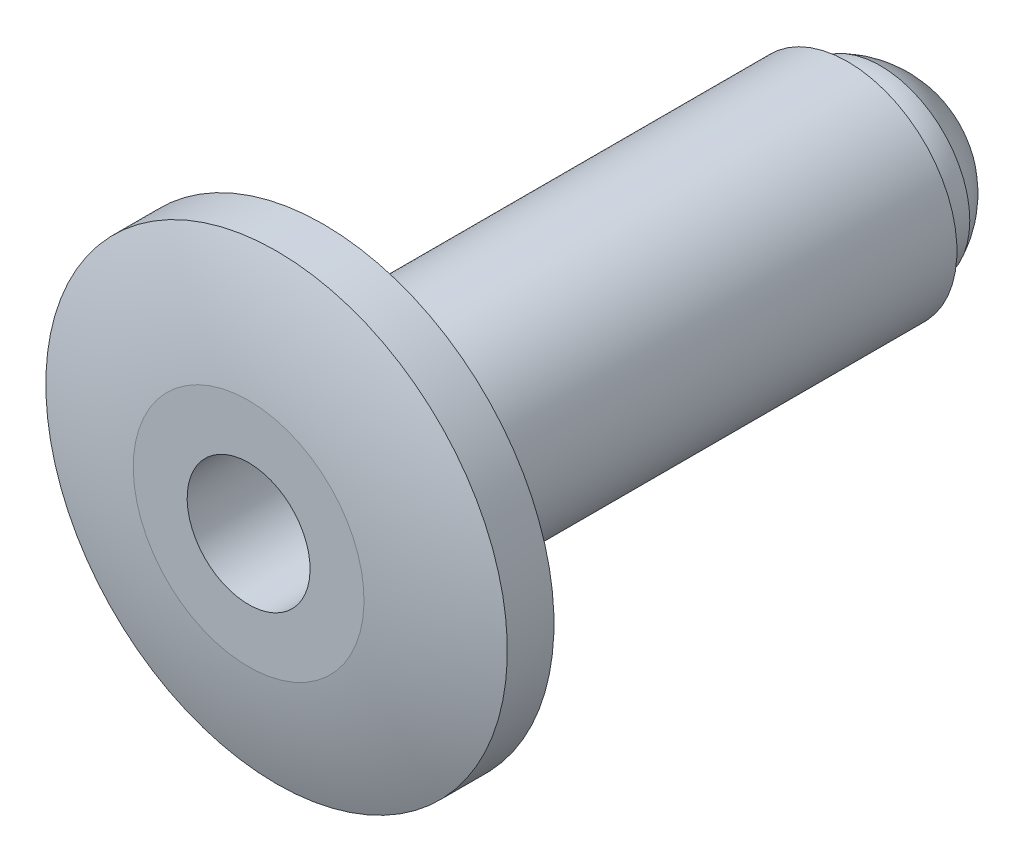
ISO-10303-21;
HEADER;
FILE_DESCRIPTION(('STEP AP214'),'2;1');
FILE_NAME('part.step','',(''),(''),'','','');
FILE_SCHEMA(('AUTOMOTIVE_DESIGN { 1 0 10303 214 1 1 1 1 }'));
ENDSEC;
DATA;
#1=APPLICATION_CONTEXT('core data for automotive mechanical design processes');
#2=APPLICATION_PROTOCOL_DEFINITION('international standard','automotive_design',2000,#1);
#3=PRODUCT_CONTEXT('',#1,'mechanical');
#4=PRODUCT('Part','Part','',(#3));
#5=PRODUCT_RELATED_PRODUCT_CATEGORY('part','',(#4));
#6=PRODUCT_DEFINITION_FORMATION('','',#4);
#7=PRODUCT_DEFINITION_CONTEXT('part definition',#1,'design');
#8=PRODUCT_DEFINITION('design','',#6,#7);
#9=PRODUCT_DEFINITION_SHAPE('','',#8);
#10=(LENGTH_UNIT() NAMED_UNIT(*) SI_UNIT(.MILLI.,.METRE.));
#11=(NAMED_UNIT(*) PLANE_ANGLE_UNIT() SI_UNIT($,.RADIAN.));
#12=(NAMED_UNIT(*) SI_UNIT($,.STERADIAN.) SOLID_ANGLE_UNIT());
#13=UNCERTAINTY_MEASURE_WITH_UNIT(LENGTH_MEASURE(1.E-05),#10,'distance_accuracy_value','');
#14=(GEOMETRIC_REPRESENTATION_CONTEXT(3) GLOBAL_UNCERTAINTY_ASSIGNED_CONTEXT((#13)) GLOBAL_UNIT_ASSIGNED_CONTEXT((#10,
#11,#12)) REPRESENTATION_CONTEXT('',''));
#15=CARTESIAN_POINT('',(0.,0.,0.));
#16=DIRECTION('',(0.,0.,1.));
#17=DIRECTION('',(1.,0.,0.));
#18=AXIS2_PLACEMENT_3D('',#15,#16,#17);
#19=CARTESIAN_POINT('',(0.,0.,-5.61113958093253));
#20=DIRECTION('',(1.,0.,0.));
#21=DIRECTION('',(0.,-1.,0.));
#22=AXIS2_PLACEMENT_3D('',#19,#20,#21);
#23=SPHERICAL_SURFACE('',#22,1.07764284094247);
#24=CARTESIAN_POINT('',(0.,0.,-5.61113958093253));
#25=DIRECTION('',(0.,0.,1.));
#26=DIRECTION('',(1.,0.,0.));
#27=AXIS2_PLACEMENT_3D('',#24,#25,#26);
#28=SPHERICAL_SURFACE('',#27,1.07764284094247);
#29=CARTESIAN_POINT('',(0.,0.,-6.07129453125));
#30=DIRECTION('',(0.,0.,1.));
#31=DIRECTION('',(1.,0.,0.));
#32=AXIS2_PLACEMENT_3D('',#29,#30,#31);
#33=CIRCLE('',#32,0.974459601180514);
#34=CARTESIAN_POINT('',(0.974459601180514,0.,-6.07129453125));
#35=VERTEX_POINT('',#34);
#36=EDGE_CURVE('P0_E26',#35,#35,#33,.T.);
#37=ORIENTED_EDGE('',*,*,#36,.F.);
#38=EDGE_LOOP('',(#37));
#39=FACE_BOUND('',#38,.T.);
#40=ADVANCED_FACE('P0_F17',(#39),#28,.T.);
#41=CARTESIAN_POINT('',(0.,0.9525,-5.715));
#42=DIRECTION('',(0.,0.,-1.));
#43=DIRECTION('',(0.,-1.,0.));
#44=AXIS2_PLACEMENT_3D('',#41,#42,#43);
#45=PLANE('',#44);
#46=CARTESIAN_POINT('',(0.,0.,-5.715));
#47=DIRECTION('',(0.,0.,1.));
#48=DIRECTION('',(1.,0.,0.));
#49=AXIS2_PLACEMENT_3D('',#46,#47,#48);
#50=CIRCLE('',#49,0.9525);
#51=CARTESIAN_POINT('',(0.9525,0.,-5.715));
#52=VERTEX_POINT('',#51);
#53=EDGE_CURVE('P0_E11',#52,#52,#50,.T.);
#54=ORIENTED_EDGE('',*,*,#53,.T.);
#55=EDGE_LOOP('',(#54));
#56=FACE_BOUND('',#55,.T.);
#57=ADVANCED_FACE('P0_F19',(#56),#45,.F.);
#58=CARTESIAN_POINT('',(0.,0.,-5.9525296875));
#59=DIRECTION('',(-1.,0.,0.));
#60=DIRECTION('',(0.,1.,0.));
#61=AXIS2_PLACEMENT_3D('',#58,#59,#60);
#62=SPHERICAL_SURFACE('',#61,0.9816703125);
#63=CARTESIAN_POINT('',(0.,0.,-5.9525296875));
#64=DIRECTION('',(0.,0.,1.));
#65=DIRECTION('',(1.,0.,0.));
#66=AXIS2_PLACEMENT_3D('',#63,#64,#65);
#67=SPHERICAL_SURFACE('',#66,0.9816703125);
#68=ORIENTED_EDGE('',*,*,#53,.F.);
#69=EDGE_LOOP('',(#68));
#70=FACE_BOUND('',#69,.T.);
#71=ORIENTED_EDGE('',*,*,#36,.T.);
#72=EDGE_LOOP('',(#71));
#73=FACE_BOUND('',#72,.T.);
#74=ADVANCED_FACE('P0_F42',(#70,#73),#67,.T.);
#75=CLOSED_SHELL('',(#40,#57,#74));
#76=MANIFOLD_SOLID_BREP('P0_B1',#75);
#77=CARTESIAN_POINT('',(0.,1.190625,0.));
#78=DIRECTION('',(0.,0.,-1.));
#79=DIRECTION('',(-1.,0.,0.));
#80=AXIS2_PLACEMENT_3D('',#77,#78,#79);
#81=PLANE('',#80);
#82=CARTESIAN_POINT('',(0.,0.,0.));
#83=DIRECTION('',(0.,0.,-1.));
#84=DIRECTION('',(0.,1.,0.));
#85=AXIS2_PLACEMENT_3D('',#82,#83,#84);
#86=CIRCLE('',#85,1.190625);
#87=CARTESIAN_POINT('',(0.,1.190625,0.));
#88=VERTEX_POINT('',#87);
#89=EDGE_CURVE('P1_E11',#88,#88,#86,.T.);
#90=ORIENTED_EDGE('',*,*,#89,.F.);
#91=EDGE_LOOP('',(#90));
#92=FACE_BOUND('',#91,.T.);
#93=CARTESIAN_POINT('',(0.,0.,0.));
#94=DIRECTION('',(0.,0.,1.));
#95=DIRECTION('',(0.,1.,0.));
#96=AXIS2_PLACEMENT_3D('',#93,#94,#95);
#97=CIRCLE('',#96,1.35924380805);
#98=CARTESIAN_POINT('',(0.,1.35924380805,0.));
#99=VERTEX_POINT('',#98);
#100=EDGE_CURVE('P1_E224',#99,#99,#97,.T.);
#101=ORIENTED_EDGE('',*,*,#100,.F.);
#102=EDGE_LOOP('',(#101));
#103=FACE_BOUND('',#102,.T.);
#104=ADVANCED_FACE('P1_F17',(#92,#103),#81,.T.);
#105=CARTESIAN_POINT('',(0.,0.,-5.715));
#106=DIRECTION('',(0.,0.,-1.));
#107=DIRECTION('',(0.,1.,0.));
#108=AXIS2_PLACEMENT_3D('',#105,#106,#107);
#109=CYLINDRICAL_SURFACE('',#108,1.190625);
#110=ORIENTED_EDGE('',*,*,#89,.T.);
#111=EDGE_LOOP('',(#110));
#112=FACE_BOUND('',#111,.T.);
#113=CARTESIAN_POINT('',(0.,0.,-5.715));
#114=DIRECTION('',(0.,0.,-1.));
#115=DIRECTION('',(0.,1.,0.));
#116=AXIS2_PLACEMENT_3D('',#113,#114,#115);
#117=CIRCLE('',#116,1.190625);
#118=CARTESIAN_POINT('',(0.,1.190625,-5.715));
#119=VERTEX_POINT('',#118);
#120=EDGE_CURVE('P1_E26',#119,#119,#117,.T.);
#121=ORIENTED_EDGE('',*,*,#120,.F.);
#122=EDGE_LOOP('',(#121));
#123=FACE_BOUND('',#122,.T.);
#124=ADVANCED_FACE('P1_F19',(#112,#123),#109,.T.);
#125=CARTESIAN_POINT('',(0.,1.190625,-5.715));
#126=DIRECTION('',(0.,0.,-1.));
#127=DIRECTION('',(-1.,0.,0.));
#128=AXIS2_PLACEMENT_3D('',#125,#126,#127);
#129=PLANE('',#128);
#130=ORIENTED_EDGE('',*,*,#120,.T.);
#131=EDGE_LOOP('',(#130));
#132=FACE_BOUND('',#131,.T.);
#133=ADVANCED_FACE('P1_F595',(#132),#129,.T.);
#134=CARTESIAN_POINT('',(0.,0.,9.3853));
#135=DIRECTION('',(0.,0.,1.));
#136=DIRECTION('',(1.,0.,0.));
#137=AXIS2_PLACEMENT_3D('',#134,#135,#136);
#138=CYLINDRICAL_SURFACE('',#137,1.35924380805);
#139=ORIENTED_EDGE('',*,*,#100,.T.);
#140=EDGE_LOOP('',(#139));
#141=FACE_BOUND('',#140,.T.);
#142=CARTESIAN_POINT('',(0.,0.,-0.0254000000000018));
#143=DIRECTION('',(0.,0.,1.));
#144=DIRECTION('',(1.,0.,0.));
#145=AXIS2_PLACEMENT_3D('',#142,#143,#144);
#146=CIRCLE('',#145,1.35924380805);
#147=CARTESIAN_POINT('',(1.35924380805,0.,-0.0254000000000018));
#148=VERTEX_POINT('',#147);
#149=EDGE_CURVE('P1_E221',#148,#148,#146,.T.);
#150=ORIENTED_EDGE('',*,*,#149,.F.);
#151=EDGE_LOOP('',(#150));
#152=FACE_BOUND('',#151,.T.);
#153=ADVANCED_FACE('P1_F586',(#141,#152),#138,.F.);
#154=CARTESIAN_POINT('',(1.43418608895,0.,-0.025400000000001));
#155=DIRECTION('',(0.,0.,-1.));
#156=DIRECTION('',(0.,-1.,0.));
#157=AXIS2_PLACEMENT_3D('',#154,#155,#156);
#158=PLANE('',#157);
#159=ORIENTED_EDGE('',*,*,#149,.T.);
#160=EDGE_LOOP('',(#159));
#161=FACE_BOUND('',#160,.T.);
#162=CARTESIAN_POINT('',(0.,0.,-0.0254000000000018));
#163=DIRECTION('',(0.,0.,1.));
#164=DIRECTION('',(1.,0.,0.));
#165=AXIS2_PLACEMENT_3D('',#162,#163,#164);
#166=CIRCLE('',#165,1.43418608895);
#167=CARTESIAN_POINT('',(1.43418608895,0.,-0.0254000000000018));
#168=VERTEX_POINT('',#167);
#169=EDGE_CURVE('P1_E218',#168,#168,#166,.T.);
#170=ORIENTED_EDGE('',*,*,#169,.F.);
#171=EDGE_LOOP('',(#170));
#172=FACE_BOUND('',#171,.T.);
#173=ADVANCED_FACE('P1_F577',(#161,#172),#158,.T.);
#174=CARTESIAN_POINT('',(0.,0.,9.3853));
#175=DIRECTION('',(0.,0.,1.));
#176=DIRECTION('',(1.,0.,0.));
#177=AXIS2_PLACEMENT_3D('',#174,#175,#176);
#178=CYLINDRICAL_SURFACE('',#177,1.43418608895);
#179=ORIENTED_EDGE('',*,*,#169,.T.);
#180=EDGE_LOOP('',(#179));
#181=FACE_BOUND('',#180,.T.);
#182=CARTESIAN_POINT('',(0.,0.,0.));
#183=DIRECTION('',(0.,0.,-1.));
#184=DIRECTION('',(0.,1.,0.));
#185=AXIS2_PLACEMENT_3D('',#182,#183,#184);
#186=CIRCLE('',#185,1.43418608895);
#187=CARTESIAN_POINT('',(0.,1.43418608895,0.));
#188=VERTEX_POINT('',#187);
#189=EDGE_CURVE('P1_E151',#188,#188,#186,.T.);
#190=ORIENTED_EDGE('',*,*,#189,.T.);
#191=EDGE_LOOP('',(#190));
#192=FACE_BOUND('',#191,.T.);
#193=ADVANCED_FACE('P1_F568',(#181,#192),#178,.T.);
#194=CARTESIAN_POINT('',(0.,1.190625,0.));
#195=DIRECTION('',(0.,0.,-1.));
#196=DIRECTION('',(-1.,0.,0.));
#197=AXIS2_PLACEMENT_3D('',#194,#195,#196);
#198=PLANE('',#197);
#199=CARTESIAN_POINT('',(0.,0.,0.));
#200=DIRECTION('',(0.,0.,-1.));
#201=DIRECTION('',(0.,1.,0.));
#202=AXIS2_PLACEMENT_3D('',#199,#200,#201);
#203=CIRCLE('',#202,2.2660426265925);
#204=CARTESIAN_POINT('',(0.,2.2660426265925,0.));
#205=VERTEX_POINT('',#204);
#206=EDGE_CURVE('P1_E166',#205,#205,#203,.T.);
#207=ORIENTED_EDGE('',*,*,#206,.F.);
#208=EDGE_LOOP('',(#207));
#209=FACE_BOUND('',#208,.T.);
#210=CARTESIAN_POINT('',(0.,0.,0.));
#211=DIRECTION('',(0.,0.,-1.));
#212=DIRECTION('',(0.,1.,0.));
#213=AXIS2_PLACEMENT_3D('',#210,#211,#212);
#214=CIRCLE('',#213,2.5146);
#215=CARTESIAN_POINT('',(0.,2.5146,0.));
#216=VERTEX_POINT('',#215);
#217=EDGE_CURVE('P1_E215',#216,#216,#214,.T.);
#218=ORIENTED_EDGE('',*,*,#217,.T.);
#219=EDGE_LOOP('',(#218));
#220=FACE_BOUND('',#219,.T.);
#221=ADVANCED_FACE('P1_F559',(#209,#220),#198,.T.);
#222=CARTESIAN_POINT('',(0.,0.,-5.715));
#223=DIRECTION('',(0.,0.,-1.));
#224=DIRECTION('',(0.,1.,0.));
#225=AXIS2_PLACEMENT_3D('',#222,#223,#224);
#226=CYLINDRICAL_SURFACE('',#225,2.5146);
#227=CARTESIAN_POINT('',(0.,0.,0.508));
#228=DIRECTION('',(0.,0.,-1.));
#229=DIRECTION('',(0.,1.,0.));
#230=AXIS2_PLACEMENT_3D('',#227,#228,#229);
#231=CIRCLE('',#230,2.5146);
#232=CARTESIAN_POINT('',(0.,2.5146,0.508));
#233=VERTEX_POINT('',#232);
#234=EDGE_CURVE('P1_E212',#233,#233,#231,.T.);
#235=ORIENTED_EDGE('',*,*,#234,.T.);
#236=EDGE_LOOP('',(#235));
#237=FACE_BOUND('',#236,.T.);
#238=ORIENTED_EDGE('',*,*,#217,.F.);
#239=EDGE_LOOP('',(#238));
#240=FACE_BOUND('',#239,.T.);
#241=ADVANCED_FACE('P1_F550',(#237,#240),#226,.T.);
#242=CARTESIAN_POINT('',(0.,0.,-4.66347968749999));
#243=DIRECTION('',(0.,0.,-1.));
#244=DIRECTION('',(0.,1.,0.));
#245=AXIS2_PLACEMENT_3D('',#242,#243,#244);
#246=DEGENERATE_TOROIDAL_SURFACE('',#245,0.5953125,5.51614599751323,.T.);
#247=CARTESIAN_POINT('',(0.,0.,0.8128));
#248=DIRECTION('',(0.,0.,-1.));
#249=DIRECTION('',(0.,1.,0.));
#250=AXIS2_PLACEMENT_3D('',#247,#248,#249);
#251=CIRCLE('',#250,1.2573);
#252=CARTESIAN_POINT('',(0.,1.2573,0.8128));
#253=VERTEX_POINT('',#252);
#254=EDGE_CURVE('P1_E209',#253,#253,#251,.T.);
#255=ORIENTED_EDGE('',*,*,#254,.T.);
#256=EDGE_LOOP('',(#255));
#257=FACE_BOUND('',#256,.T.);
#258=ORIENTED_EDGE('',*,*,#234,.F.);
#259=EDGE_LOOP('',(#258));
#260=FACE_BOUND('',#259,.T.);
#261=ADVANCED_FACE('P1_F541',(#257,#260),#246,.T.);
#262=CARTESIAN_POINT('',(0.,0.6697265625,0.8128));
#263=DIRECTION('',(0.,0.,1.));
#264=DIRECTION('',(0.,-1.,0.));
#265=AXIS2_PLACEMENT_3D('',#262,#263,#264);
#266=PLANE('',#265);
#267=CARTESIAN_POINT('',(0.,0.,0.8128));
#268=DIRECTION('',(0.,0.,-1.));
#269=DIRECTION('',(0.,1.,0.));
#270=AXIS2_PLACEMENT_3D('',#267,#268,#269);
#271=CIRCLE('',#270,0.669726562500001);
#272=CARTESIAN_POINT('',(0.,0.6697265625,0.8128));
#273=VERTEX_POINT('',#272);
#274=EDGE_CURVE('P1_E165',#273,#273,#271,.T.);
#275=ORIENTED_EDGE('',*,*,#274,.T.);
#276=EDGE_LOOP('',(#275));
#277=FACE_BOUND('',#276,.T.);
#278=ORIENTED_EDGE('',*,*,#254,.F.);
#279=EDGE_LOOP('',(#278));
#280=FACE_BOUND('',#279,.T.);
#281=ADVANCED_FACE('P1_F524',(#277,#280),#266,.T.);
#282=CARTESIAN_POINT('',(0.,0.,-5.715));
#283=DIRECTION('',(0.,0.,-1.));
#284=DIRECTION('',(0.,1.,0.));
#285=AXIS2_PLACEMENT_3D('',#282,#283,#284);
#286=CYLINDRICAL_SURFACE('',#285,0.669726562500001);
#287=CARTESIAN_POINT('',(0.,0.,-0.5715));
#288=DIRECTION('',(0.,0.,-1.));
#289=DIRECTION('',(0.,1.,0.));
#290=AXIS2_PLACEMENT_3D('',#287,#288,#289);
#291=CIRCLE('',#290,0.669726562500001);
#292=CARTESIAN_POINT('',(0.,0.6697265625,-0.5715));
#293=VERTEX_POINT('',#292);
#294=EDGE_CURVE('P1_E162',#293,#293,#291,.T.);
#295=ORIENTED_EDGE('',*,*,#294,.T.);
#296=EDGE_LOOP('',(#295));
#297=FACE_BOUND('',#296,.T.);
#298=ORIENTED_EDGE('',*,*,#274,.F.);
#299=EDGE_LOOP('',(#298));
#300=FACE_BOUND('',#299,.T.);
#301=ADVANCED_FACE('P1_F515',(#297,#300),#286,.F.);
#302=CARTESIAN_POINT('',(0.,0.6697265625,-0.5715));
#303=DIRECTION('',(0.,0.,1.));
#304=DIRECTION('',(0.,-1.,0.));
#305=AXIS2_PLACEMENT_3D('',#302,#303,#304);
#306=PLANE('',#305);
#307=ORIENTED_EDGE('',*,*,#294,.F.);
#308=EDGE_LOOP('',(#307));
#309=FACE_BOUND('',#308,.T.);
#310=ADVANCED_FACE('P1_F506',(#309),#306,.T.);
#311=CARTESIAN_POINT('',(0.,0.,9.3853));
#312=DIRECTION('',(0.,0.,1.));
#313=DIRECTION('',(1.,0.,0.));
#314=AXIS2_PLACEMENT_3D('',#311,#312,#313);
#315=CYLINDRICAL_SURFACE('',#314,2.2660426265925);
#316=CARTESIAN_POINT('',(0.,0.,-0.0254));
#317=DIRECTION('',(0.,0.,1.));
#318=DIRECTION('',(1.,0.,0.));
#319=AXIS2_PLACEMENT_3D('',#316,#317,#318);
#320=CIRCLE('',#319,2.2660426265925);
#321=CARTESIAN_POINT('',(2.2660426265925,0.,-0.0254));
#322=VERTEX_POINT('',#321);
#323=EDGE_CURVE('P1_E202',#322,#322,#320,.T.);
#324=ORIENTED_EDGE('',*,*,#323,.T.);
#325=EDGE_LOOP('',(#324));
#326=FACE_BOUND('',#325,.T.);
#327=ORIENTED_EDGE('',*,*,#206,.T.);
#328=EDGE_LOOP('',(#327));
#329=FACE_BOUND('',#328,.T.);
#330=ADVANCED_FACE('P1_F402',(#326,#329),#315,.T.);
#331=CARTESIAN_POINT('',(2.1911003456925,0.,-0.0254000000000009));
#332=DIRECTION('',(0.,0.,-1.));
#333=DIRECTION('',(0.,-1.,0.));
#334=AXIS2_PLACEMENT_3D('',#331,#332,#333);
#335=PLANE('',#334);
#336=CARTESIAN_POINT('',(0.,0.,-0.0254));
#337=DIRECTION('',(0.,0.,1.));
#338=DIRECTION('',(1.,0.,0.));
#339=AXIS2_PLACEMENT_3D('',#336,#337,#338);
#340=CIRCLE('',#339,2.1911003456925);
#341=CARTESIAN_POINT('',(2.1911003456925,0.,-0.0254));
#342=VERTEX_POINT('',#341);
#343=EDGE_CURVE('P1_E199',#342,#342,#340,.T.);
#344=ORIENTED_EDGE('',*,*,#343,.T.);
#345=EDGE_LOOP('',(#344));
#346=FACE_BOUND('',#345,.T.);
#347=ORIENTED_EDGE('',*,*,#323,.F.);
#348=EDGE_LOOP('',(#347));
#349=FACE_BOUND('',#348,.T.);
#350=ADVANCED_FACE('P1_F384',(#346,#349),#335,.T.);
#351=CARTESIAN_POINT('',(0.,0.,9.3853));
#352=DIRECTION('',(0.,0.,1.));
#353=DIRECTION('',(1.,0.,0.));
#354=AXIS2_PLACEMENT_3D('',#351,#352,#353);
#355=CYLINDRICAL_SURFACE('',#354,2.1911003456925);
#356=CARTESIAN_POINT('',(0.,0.,0.));
#357=DIRECTION('',(0.,0.,1.));
#358=DIRECTION('',(0.,1.,0.));
#359=AXIS2_PLACEMENT_3D('',#356,#357,#358);
#360=CIRCLE('',#359,2.1911003456925);
#361=CARTESIAN_POINT('',(0.,2.1911003456925,0.));
#362=VERTEX_POINT('',#361);
#363=EDGE_CURVE('P1_E157',#362,#362,#360,.T.);
#364=ORIENTED_EDGE('',*,*,#363,.T.);
#365=EDGE_LOOP('',(#364));
#366=FACE_BOUND('',#365,.T.);
#367=ORIENTED_EDGE('',*,*,#343,.F.);
#368=EDGE_LOOP('',(#367));
#369=FACE_BOUND('',#368,.T.);
#370=ADVANCED_FACE('P1_F379',(#366,#369),#355,.F.);
#371=CARTESIAN_POINT('',(0.,0.,9.3853));
#372=DIRECTION('',(0.,0.,1.));
#373=DIRECTION('',(1.,0.,0.));
#374=AXIS2_PLACEMENT_3D('',#371,#372,#373);
#375=CYLINDRICAL_SURFACE('',#374,1.998748888575);
#376=CARTESIAN_POINT('',(0.,0.,-0.0254));
#377=DIRECTION('',(0.,0.,1.));
#378=DIRECTION('',(1.,0.,0.));
#379=AXIS2_PLACEMENT_3D('',#376,#377,#378);
#380=CIRCLE('',#379,1.998748888575);
#381=CARTESIAN_POINT('',(1.998748888575,0.,-0.0254));
#382=VERTEX_POINT('',#381);
#383=EDGE_CURVE('P1_E196',#382,#382,#380,.T.);
#384=ORIENTED_EDGE('',*,*,#383,.T.);
#385=EDGE_LOOP('',(#384));
#386=FACE_BOUND('',#385,.T.);
#387=CARTESIAN_POINT('',(0.,0.,0.));
#388=DIRECTION('',(0.,0.,-1.));
#389=DIRECTION('',(0.,1.,0.));
#390=AXIS2_PLACEMENT_3D('',#387,#388,#389);
#391=CIRCLE('',#390,1.998748888575);
#392=CARTESIAN_POINT('',(0.,1.998748888575,0.));
#393=VERTEX_POINT('',#392);
#394=EDGE_CURVE('P1_E169',#393,#393,#391,.T.);
#395=ORIENTED_EDGE('',*,*,#394,.T.);
#396=EDGE_LOOP('',(#395));
#397=FACE_BOUND('',#396,.T.);
#398=ADVANCED_FACE('P1_F383',(#386,#397),#375,.T.);
#399=CARTESIAN_POINT('',(1.923806607675,0.,-0.0254000000000009));
#400=DIRECTION('',(0.,0.,-1.));
#401=DIRECTION('',(0.,-1.,0.));
#402=AXIS2_PLACEMENT_3D('',#399,#400,#401);
#403=PLANE('',#402);
#404=CARTESIAN_POINT('',(0.,0.,-0.0254));
#405=DIRECTION('',(0.,0.,1.));
#406=DIRECTION('',(1.,0.,0.));
#407=AXIS2_PLACEMENT_3D('',#404,#405,#406);
#408=CIRCLE('',#407,1.923806607675);
#409=CARTESIAN_POINT('',(1.923806607675,0.,-0.0254));
#410=VERTEX_POINT('',#409);
#411=EDGE_CURVE('P1_E183',#410,#410,#408,.T.);
#412=ORIENTED_EDGE('',*,*,#411,.T.);
#413=EDGE_LOOP('',(#412));
#414=FACE_BOUND('',#413,.T.);
#415=ORIENTED_EDGE('',*,*,#383,.F.);
#416=EDGE_LOOP('',(#415));
#417=FACE_BOUND('',#416,.T.);
#418=ADVANCED_FACE('P1_F428',(#414,#417),#403,.T.);
#419=CARTESIAN_POINT('',(0.,0.,9.3853));
#420=DIRECTION('',(0.,0.,1.));
#421=DIRECTION('',(1.,0.,0.));
#422=AXIS2_PLACEMENT_3D('',#419,#420,#421);
#423=CYLINDRICAL_SURFACE('',#422,1.923806607675);
#424=CARTESIAN_POINT('',(0.,0.,0.));
#425=DIRECTION('',(0.,0.,1.));
#426=DIRECTION('',(0.,1.,0.));
#427=AXIS2_PLACEMENT_3D('',#424,#425,#426);
#428=CIRCLE('',#427,1.923806607675);
#429=CARTESIAN_POINT('',(0.,1.923806607675,0.));
#430=VERTEX_POINT('',#429);
#431=EDGE_CURVE('P1_E172',#430,#430,#428,.T.);
#432=ORIENTED_EDGE('',*,*,#431,.T.);
#433=EDGE_LOOP('',(#432));
#434=FACE_BOUND('',#433,.T.);
#435=ORIENTED_EDGE('',*,*,#411,.F.);
#436=EDGE_LOOP('',(#435));
#437=FACE_BOUND('',#436,.T.);
#438=ADVANCED_FACE('P1_F422',(#434,#437),#423,.F.);
#439=CARTESIAN_POINT('',(0.,0.,9.3853));
#440=DIRECTION('',(0.,0.,1.));
#441=DIRECTION('',(1.,0.,0.));
#442=AXIS2_PLACEMENT_3D('',#439,#440,#441);
#443=CYLINDRICAL_SURFACE('',#442,1.81389258633);
#444=CARTESIAN_POINT('',(0.,0.,-0.0254));
#445=DIRECTION('',(0.,0.,1.));
#446=DIRECTION('',(1.,0.,0.));
#447=AXIS2_PLACEMENT_3D('',#444,#445,#446);
#448=CIRCLE('',#447,1.81389258633);
#449=CARTESIAN_POINT('',(1.81389258633,0.,-0.0254));
#450=VERTEX_POINT('',#449);
#451=EDGE_CURVE('P1_E180',#450,#450,#448,.T.);
#452=ORIENTED_EDGE('',*,*,#451,.T.);
#453=EDGE_LOOP('',(#452));
#454=FACE_BOUND('',#453,.T.);
#455=CARTESIAN_POINT('',(0.,0.,0.));
#456=DIRECTION('',(0.,0.,-1.));
#457=DIRECTION('',(0.,1.,0.));
#458=AXIS2_PLACEMENT_3D('',#455,#456,#457);
#459=CIRCLE('',#458,1.81389258633);
#460=CARTESIAN_POINT('',(0.,1.81389258633,0.));
#461=VERTEX_POINT('',#460);
#462=EDGE_CURVE('P1_E175',#461,#461,#459,.T.);
#463=ORIENTED_EDGE('',*,*,#462,.T.);
#464=EDGE_LOOP('',(#463));
#465=FACE_BOUND('',#464,.T.);
#466=ADVANCED_FACE('P1_F417',(#454,#465),#443,.T.);
#467=CARTESIAN_POINT('',(1.73895030543,0.,-0.0254000000000009));
#468=DIRECTION('',(0.,0.,-1.));
#469=DIRECTION('',(0.,-1.,0.));
#470=AXIS2_PLACEMENT_3D('',#467,#468,#469);
#471=PLANE('',#470);
#472=CARTESIAN_POINT('',(0.,0.,-0.0254));
#473=DIRECTION('',(0.,0.,1.));
#474=DIRECTION('',(1.,0.,0.));
#475=AXIS2_PLACEMENT_3D('',#472,#473,#474);
#476=CIRCLE('',#475,1.73895030543);
#477=CARTESIAN_POINT('',(1.73895030543,0.,-0.0254));
#478=VERTEX_POINT('',#477);
#479=EDGE_CURVE('P1_E184',#478,#478,#476,.T.);
#480=ORIENTED_EDGE('',*,*,#479,.T.);
#481=EDGE_LOOP('',(#480));
#482=FACE_BOUND('',#481,.T.);
#483=ORIENTED_EDGE('',*,*,#451,.F.);
#484=EDGE_LOOP('',(#483));
#485=FACE_BOUND('',#484,.T.);
#486=ADVANCED_FACE('P1_F421',(#482,#485),#471,.T.);
#487=CARTESIAN_POINT('',(0.,0.,9.3853));
#488=DIRECTION('',(0.,0.,1.));
#489=DIRECTION('',(1.,0.,0.));
#490=AXIS2_PLACEMENT_3D('',#487,#488,#489);
#491=CYLINDRICAL_SURFACE('',#490,1.73895030543);
#492=CARTESIAN_POINT('',(0.,0.,0.));
#493=DIRECTION('',(0.,0.,1.));
#494=DIRECTION('',(0.,1.,0.));
#495=AXIS2_PLACEMENT_3D('',#492,#493,#494);
#496=CIRCLE('',#495,1.73895030543);
#497=CARTESIAN_POINT('',(0.,1.73895030543,0.));
#498=VERTEX_POINT('',#497);
#499=EDGE_CURVE('P1_E179',#498,#498,#496,.T.);
#500=ORIENTED_EDGE('',*,*,#499,.T.);
#501=EDGE_LOOP('',(#500));
#502=FACE_BOUND('',#501,.T.);
#503=ORIENTED_EDGE('',*,*,#479,.F.);
#504=EDGE_LOOP('',(#503));
#505=FACE_BOUND('',#504,.T.);
#506=ADVANCED_FACE('P1_F458',(#502,#505),#491,.F.);
#507=CARTESIAN_POINT('',(0.,0.,9.3853));
#508=DIRECTION('',(0.,0.,1.));
#509=DIRECTION('',(1.,0.,0.));
#510=AXIS2_PLACEMENT_3D('',#507,#508,#509);
#511=CYLINDRICAL_SURFACE('',#510,1.606553070225);
#512=CARTESIAN_POINT('',(0.,0.,-0.0254));
#513=DIRECTION('',(0.,0.,1.));
#514=DIRECTION('',(1.,0.,0.));
#515=AXIS2_PLACEMENT_3D('',#512,#513,#514);
#516=CIRCLE('',#515,1.606553070225);
#517=CARTESIAN_POINT('',(1.606553070225,0.,-0.0254));
#518=VERTEX_POINT('',#517);
#519=EDGE_CURVE('P1_E189',#518,#518,#516,.T.);
#520=ORIENTED_EDGE('',*,*,#519,.T.);
#521=EDGE_LOOP('',(#520));
#522=FACE_BOUND('',#521,.T.);
#523=CARTESIAN_POINT('',(0.,0.,0.));
#524=DIRECTION('',(0.,0.,-1.));
#525=DIRECTION('',(0.,1.,0.));
#526=AXIS2_PLACEMENT_3D('',#523,#524,#525);
#527=CIRCLE('',#526,1.606553070225);
#528=CARTESIAN_POINT('',(0.,1.606553070225,0.));
#529=VERTEX_POINT('',#528);
#530=EDGE_CURVE('P1_E176',#529,#529,#527,.T.);
#531=ORIENTED_EDGE('',*,*,#530,.T.);
#532=EDGE_LOOP('',(#531));
#533=FACE_BOUND('',#532,.T.);
#534=ADVANCED_FACE('P1_F441',(#522,#533),#511,.T.);
#535=CARTESIAN_POINT('',(1.531610789325,0.,-0.0254000000000009));
#536=DIRECTION('',(0.,0.,-1.));
#537=DIRECTION('',(0.,-1.,0.));
#538=AXIS2_PLACEMENT_3D('',#535,#536,#537);
#539=PLANE('',#538);
#540=CARTESIAN_POINT('',(0.,0.,-0.0254));
#541=DIRECTION('',(0.,0.,1.));
#542=DIRECTION('',(1.,0.,0.));
#543=AXIS2_PLACEMENT_3D('',#540,#541,#542);
#544=CIRCLE('',#543,1.531610789325);
#545=CARTESIAN_POINT('',(1.531610789325,0.,-0.0254));
#546=VERTEX_POINT('',#545);
#547=EDGE_CURVE('P1_E160',#546,#546,#544,.T.);
#548=ORIENTED_EDGE('',*,*,#547,.T.);
#549=EDGE_LOOP('',(#548));
#550=FACE_BOUND('',#549,.T.);
#551=ORIENTED_EDGE('',*,*,#519,.F.);
#552=EDGE_LOOP('',(#551));
#553=FACE_BOUND('',#552,.T.);
#554=ADVANCED_FACE('P1_F437',(#550,#553),#539,.T.);
#555=CARTESIAN_POINT('',(0.,0.,9.3853));
#556=DIRECTION('',(0.,0.,1.));
#557=DIRECTION('',(1.,0.,0.));
#558=AXIS2_PLACEMENT_3D('',#555,#556,#557);
#559=CYLINDRICAL_SURFACE('',#558,1.531610789325);
#560=CARTESIAN_POINT('',(0.,0.,0.));
#561=DIRECTION('',(0.,0.,1.));
#562=DIRECTION('',(0.,1.,0.));
#563=AXIS2_PLACEMENT_3D('',#560,#561,#562);
#564=CIRCLE('',#563,1.531610789325);
#565=CARTESIAN_POINT('',(0.,1.531610789325,0.));
#566=VERTEX_POINT('',#565);
#567=EDGE_CURVE('P1_E146',#566,#566,#564,.T.);
#568=ORIENTED_EDGE('',*,*,#567,.T.);
#569=EDGE_LOOP('',(#568));
#570=FACE_BOUND('',#569,.T.);
#571=ORIENTED_EDGE('',*,*,#547,.F.);
#572=EDGE_LOOP('',(#571));
#573=FACE_BOUND('',#572,.T.);
#574=ADVANCED_FACE('P1_F147',(#570,#573),#559,.F.);
#575=CARTESIAN_POINT('',(0.,1.190625,0.));
#576=DIRECTION('',(0.,0.,-1.));
#577=DIRECTION('',(-1.,0.,0.));
#578=AXIS2_PLACEMENT_3D('',#575,#576,#577);
#579=PLANE('',#578);
#580=ORIENTED_EDGE('',*,*,#530,.F.);
#581=EDGE_LOOP('',(#580));
#582=FACE_BOUND('',#581,.T.);
#583=ORIENTED_EDGE('',*,*,#499,.F.);
#584=EDGE_LOOP('',(#583));
#585=FACE_BOUND('',#584,.T.);
#586=ADVANCED_FACE('P1_F411',(#582,#585),#579,.T.);
#587=CARTESIAN_POINT('',(0.,1.190625,0.));
#588=DIRECTION('',(0.,0.,-1.));
#589=DIRECTION('',(-1.,0.,0.));
#590=AXIS2_PLACEMENT_3D('',#587,#588,#589);
#591=PLANE('',#590);
#592=ORIENTED_EDGE('',*,*,#462,.F.);
#593=EDGE_LOOP('',(#592));
#594=FACE_BOUND('',#593,.T.);
#595=ORIENTED_EDGE('',*,*,#431,.F.);
#596=EDGE_LOOP('',(#595));
#597=FACE_BOUND('',#596,.T.);
#598=ADVANCED_FACE('P1_F393',(#594,#597),#591,.T.);
#599=CARTESIAN_POINT('',(0.,1.190625,0.));
#600=DIRECTION('',(0.,0.,-1.));
#601=DIRECTION('',(-1.,0.,0.));
#602=AXIS2_PLACEMENT_3D('',#599,#600,#601);
#603=PLANE('',#602);
#604=ORIENTED_EDGE('',*,*,#394,.F.);
#605=EDGE_LOOP('',(#604));
#606=FACE_BOUND('',#605,.T.);
#607=ORIENTED_EDGE('',*,*,#363,.F.);
#608=EDGE_LOOP('',(#607));
#609=FACE_BOUND('',#608,.T.);
#610=ADVANCED_FACE('P1_F374',(#606,#609),#603,.T.);
#611=CARTESIAN_POINT('',(0.,1.190625,0.));
#612=DIRECTION('',(0.,0.,-1.));
#613=DIRECTION('',(-1.,0.,0.));
#614=AXIS2_PLACEMENT_3D('',#611,#612,#613);
#615=PLANE('',#614);
#616=ORIENTED_EDGE('',*,*,#189,.F.);
#617=EDGE_LOOP('',(#616));
#618=FACE_BOUND('',#617,.T.);
#619=ORIENTED_EDGE('',*,*,#567,.F.);
#620=EDGE_LOOP('',(#619));
#621=FACE_BOUND('',#620,.T.);
#622=ADVANCED_FACE('P1_F370',(#618,#621),#615,.T.);
#623=CLOSED_SHELL('',(#104,#124,#133,#153,#173,#193,#221,#241,#261,#281,#301,#310,#330,#350,
#370,#398,#418,#438,#466,#486,#506,#534,#554,#574,#586,#598,#610,#622));
#624=MANIFOLD_SOLID_BREP('P1_B1',#623);
#625=ADVANCED_BREP_SHAPE_REPRESENTATION('',(#18,#76,#624),#14);
#626=SHAPE_DEFINITION_REPRESENTATION(#9,#625);
ENDSEC;
END-ISO-10303-21;
